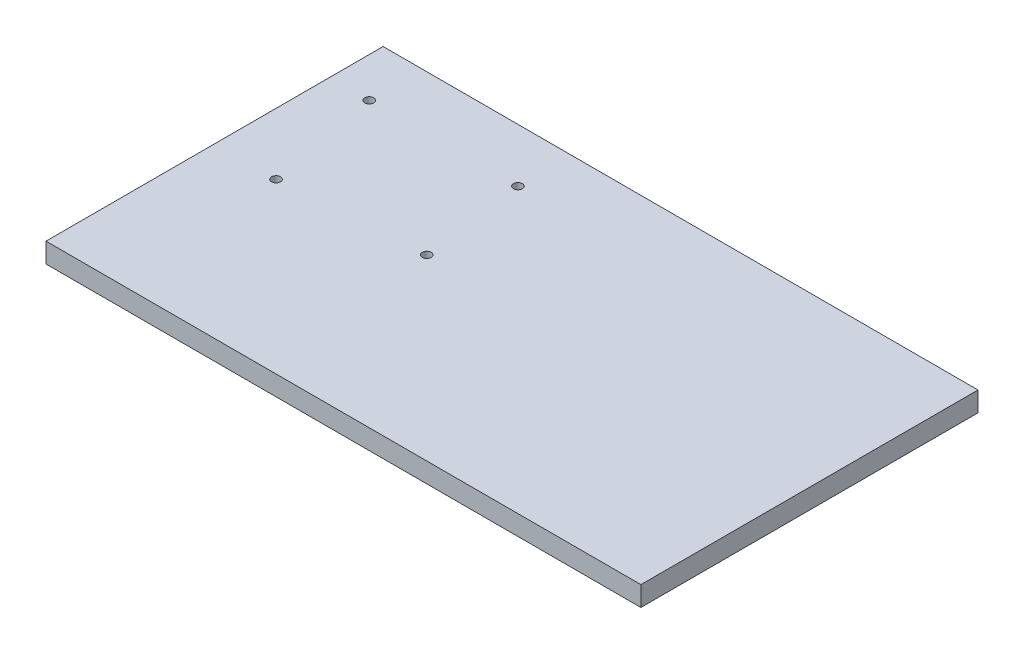
ISO-10303-21;
HEADER;
FILE_DESCRIPTION(('STEP AP214'),'2;1');
FILE_NAME('part.step','',(''),(''),'','','');
FILE_SCHEMA(('AUTOMOTIVE_DESIGN { 1 0 10303 214 1 1 1 1 }'));
ENDSEC;
DATA;
#1=APPLICATION_CONTEXT('core data for automotive mechanical design processes');
#2=APPLICATION_PROTOCOL_DEFINITION('international standard','automotive_design',2000,#1);
#3=PRODUCT_CONTEXT('',#1,'mechanical');
#4=PRODUCT('Part','Part','',(#3));
#5=PRODUCT_RELATED_PRODUCT_CATEGORY('part','',(#4));
#6=PRODUCT_DEFINITION_FORMATION('','',#4);
#7=PRODUCT_DEFINITION_CONTEXT('part definition',#1,'design');
#8=PRODUCT_DEFINITION('design','',#6,#7);
#9=PRODUCT_DEFINITION_SHAPE('','',#8);
#10=(LENGTH_UNIT() NAMED_UNIT(*) SI_UNIT(.MILLI.,.METRE.));
#11=(NAMED_UNIT(*) PLANE_ANGLE_UNIT() SI_UNIT($,.RADIAN.));
#12=(NAMED_UNIT(*) SI_UNIT($,.STERADIAN.) SOLID_ANGLE_UNIT());
#13=UNCERTAINTY_MEASURE_WITH_UNIT(LENGTH_MEASURE(1.E-05),#10,'distance_accuracy_value','');
#14=(GEOMETRIC_REPRESENTATION_CONTEXT(3) GLOBAL_UNCERTAINTY_ASSIGNED_CONTEXT((#13)) GLOBAL_UNIT_ASSIGNED_CONTEXT((#10,
#11,#12)) REPRESENTATION_CONTEXT('',''));
#15=CARTESIAN_POINT('',(0.,0.,0.));
#16=DIRECTION('',(0.,0.,1.));
#17=DIRECTION('',(1.,0.,0.));
#18=AXIS2_PLACEMENT_3D('',#15,#16,#17);
#19=CARTESIAN_POINT('',(0.,10.,0.));
#20=DIRECTION('',(0.,1.,0.));
#21=DIRECTION('',(0.,0.,1.));
#22=AXIS2_PLACEMENT_3D('',#19,#20,#21);
#23=PLANE('',#22);
#24=CARTESIAN_POINT('',(102.,10.,-90.));
#25=DIRECTION('',(0.,1.,0.));
#26=DIRECTION('',(0.,0.,1.));
#27=AXIS2_PLACEMENT_3D('',#24,#25,#26);
#28=CIRCLE('',#27,2.25000000000001);
#29=CARTESIAN_POINT('',(102.,10.,-87.75));
#30=VERTEX_POINT('',#29);
#31=EDGE_CURVE('E123',#30,#30,#28,.T.);
#32=ORIENTED_EDGE('',*,*,#31,.F.);
#33=EDGE_LOOP('',(#32));
#34=FACE_BOUND('',#33,.T.);
#35=CARTESIAN_POINT('',(20.,10.,-143.));
#36=DIRECTION('',(0.,1.,0.));
#37=DIRECTION('',(0.,0.,1.));
#38=AXIS2_PLACEMENT_3D('',#35,#36,#37);
#39=CIRCLE('',#38,2.25);
#40=CARTESIAN_POINT('',(20.,10.,-140.75));
#41=VERTEX_POINT('',#40);
#42=EDGE_CURVE('E102',#41,#41,#39,.T.);
#43=ORIENTED_EDGE('',*,*,#42,.F.);
#44=EDGE_LOOP('',(#43));
#45=FACE_BOUND('',#44,.T.);
#46=DIRECTION('',(0.,0.,1.));
#47=VECTOR('',#46,1.);
#48=CARTESIAN_POINT('',(0.,10.,-170.));
#49=LINE('',#48,#47);
#50=CARTESIAN_POINT('',(0.,10.,-170.));
#51=VERTEX_POINT('',#50);
#52=CARTESIAN_POINT('',(0.,10.,0.));
#53=VERTEX_POINT('',#52);
#54=EDGE_CURVE('E87',#51,#53,#49,.T.);
#55=ORIENTED_EDGE('',*,*,#54,.T.);
#56=DIRECTION('',(1.,0.,0.));
#57=VECTOR('',#56,1.);
#58=CARTESIAN_POINT('',(0.,10.,0.));
#59=LINE('',#58,#57);
#60=CARTESIAN_POINT('',(300.,10.,0.));
#61=VERTEX_POINT('',#60);
#62=EDGE_CURVE('E82',#53,#61,#59,.T.);
#63=ORIENTED_EDGE('',*,*,#62,.T.);
#64=DIRECTION('',(0.,0.,-1.));
#65=VECTOR('',#64,1.);
#66=CARTESIAN_POINT('',(300.,10.,-170.));
#67=LINE('',#66,#65);
#68=CARTESIAN_POINT('',(300.,10.,-170.));
#69=VERTEX_POINT('',#68);
#70=EDGE_CURVE('E85',#61,#69,#67,.T.);
#71=ORIENTED_EDGE('',*,*,#70,.T.);
#72=DIRECTION('',(-1.,0.,0.));
#73=VECTOR('',#72,1.);
#74=CARTESIAN_POINT('',(0.,10.,-170.));
#75=LINE('',#74,#73);
#76=EDGE_CURVE('E52',#69,#51,#75,.T.);
#77=ORIENTED_EDGE('',*,*,#76,.T.);
#78=EDGE_LOOP('',(#55,#63,#71,#77));
#79=FACE_BOUND('',#78,.T.);
#80=CARTESIAN_POINT('',(95.,10.,-143.));
#81=DIRECTION('',(0.,1.,0.));
#82=DIRECTION('',(0.,0.,1.));
#83=AXIS2_PLACEMENT_3D('',#80,#81,#82);
#84=CIRCLE('',#83,2.25000000000001);
#85=CARTESIAN_POINT('',(95.,10.,-140.75));
#86=VERTEX_POINT('',#85);
#87=EDGE_CURVE('E117',#86,#86,#84,.T.);
#88=ORIENTED_EDGE('',*,*,#87,.F.);
#89=EDGE_LOOP('',(#88));
#90=FACE_BOUND('',#89,.T.);
#91=CARTESIAN_POINT('',(31.,10.,-84.9977739581658));
#92=DIRECTION('',(0.,1.,0.));
#93=DIRECTION('',(0.,0.,1.));
#94=AXIS2_PLACEMENT_3D('',#91,#92,#93);
#95=CIRCLE('',#94,2.25);
#96=CARTESIAN_POINT('',(31.,10.,-82.7477739581658));
#97=VERTEX_POINT('',#96);
#98=EDGE_CURVE('E129',#97,#97,#95,.T.);
#99=ORIENTED_EDGE('',*,*,#98,.F.);
#100=EDGE_LOOP('',(#99));
#101=FACE_BOUND('',#100,.T.);
#102=ADVANCED_FACE('F35',(#34,#45,#79,#90,#101),#23,.T.);
#103=CARTESIAN_POINT('',(0.,0.,0.));
#104=DIRECTION('',(0.,1.,0.));
#105=DIRECTION('',(0.,0.,1.));
#106=AXIS2_PLACEMENT_3D('',#103,#104,#105);
#107=PLANE('',#106);
#108=DIRECTION('',(0.,0.,1.));
#109=VECTOR('',#108,1.);
#110=CARTESIAN_POINT('',(0.,0.,-170.));
#111=LINE('',#110,#109);
#112=CARTESIAN_POINT('',(0.,0.,-170.));
#113=VERTEX_POINT('',#112);
#114=CARTESIAN_POINT('',(0.,0.,0.));
#115=VERTEX_POINT('',#114);
#116=EDGE_CURVE('E99',#113,#115,#111,.T.);
#117=ORIENTED_EDGE('',*,*,#116,.F.);
#118=DIRECTION('',(-1.,0.,0.));
#119=VECTOR('',#118,1.);
#120=CARTESIAN_POINT('',(0.,0.,-170.));
#121=LINE('',#120,#119);
#122=CARTESIAN_POINT('',(300.,0.,-170.));
#123=VERTEX_POINT('',#122);
#124=EDGE_CURVE('E75',#123,#113,#121,.T.);
#125=ORIENTED_EDGE('',*,*,#124,.F.);
#126=DIRECTION('',(0.,0.,-1.));
#127=VECTOR('',#126,1.);
#128=CARTESIAN_POINT('',(300.,0.,-170.));
#129=LINE('',#128,#127);
#130=CARTESIAN_POINT('',(300.,0.,0.));
#131=VERTEX_POINT('',#130);
#132=EDGE_CURVE('E69',#131,#123,#129,.T.);
#133=ORIENTED_EDGE('',*,*,#132,.F.);
#134=DIRECTION('',(1.,0.,0.));
#135=VECTOR('',#134,1.);
#136=CARTESIAN_POINT('',(0.,0.,0.));
#137=LINE('',#136,#135);
#138=EDGE_CURVE('E91',#115,#131,#137,.T.);
#139=ORIENTED_EDGE('',*,*,#138,.F.);
#140=EDGE_LOOP('',(#117,#125,#133,#139));
#141=FACE_BOUND('',#140,.T.);
#142=CARTESIAN_POINT('',(20.,0.,-143.));
#143=DIRECTION('',(0.,1.,0.));
#144=DIRECTION('',(0.,0.,1.));
#145=AXIS2_PLACEMENT_3D('',#142,#143,#144);
#146=CIRCLE('',#145,2.25);
#147=CARTESIAN_POINT('',(20.,0.,-140.75));
#148=VERTEX_POINT('',#147);
#149=EDGE_CURVE('E114',#148,#148,#146,.T.);
#150=ORIENTED_EDGE('',*,*,#149,.T.);
#151=EDGE_LOOP('',(#150));
#152=FACE_BOUND('',#151,.T.);
#153=CARTESIAN_POINT('',(95.,0.,-143.));
#154=DIRECTION('',(0.,1.,0.));
#155=DIRECTION('',(0.,0.,1.));
#156=AXIS2_PLACEMENT_3D('',#153,#154,#155);
#157=CIRCLE('',#156,2.25000000000001);
#158=CARTESIAN_POINT('',(95.,0.,-140.75));
#159=VERTEX_POINT('',#158);
#160=EDGE_CURVE('E120',#159,#159,#157,.T.);
#161=ORIENTED_EDGE('',*,*,#160,.T.);
#162=EDGE_LOOP('',(#161));
#163=FACE_BOUND('',#162,.T.);
#164=CARTESIAN_POINT('',(102.,0.,-90.));
#165=DIRECTION('',(0.,1.,0.));
#166=DIRECTION('',(0.,0.,1.));
#167=AXIS2_PLACEMENT_3D('',#164,#165,#166);
#168=CIRCLE('',#167,2.25000000000001);
#169=CARTESIAN_POINT('',(102.,0.,-87.75));
#170=VERTEX_POINT('',#169);
#171=EDGE_CURVE('E126',#170,#170,#168,.T.);
#172=ORIENTED_EDGE('',*,*,#171,.T.);
#173=EDGE_LOOP('',(#172));
#174=FACE_BOUND('',#173,.T.);
#175=CARTESIAN_POINT('',(31.,0.,-84.9977739581658));
#176=DIRECTION('',(0.,1.,0.));
#177=DIRECTION('',(0.,0.,1.));
#178=AXIS2_PLACEMENT_3D('',#175,#176,#177);
#179=CIRCLE('',#178,2.25);
#180=CARTESIAN_POINT('',(31.,0.,-82.7477739581658));
#181=VERTEX_POINT('',#180);
#182=EDGE_CURVE('E132',#181,#181,#179,.T.);
#183=ORIENTED_EDGE('',*,*,#182,.T.);
#184=EDGE_LOOP('',(#183));
#185=FACE_BOUND('',#184,.T.);
#186=ADVANCED_FACE('F110',(#141,#152,#163,#174,#185),#107,.F.);
#187=CARTESIAN_POINT('',(0.,10.,-170.));
#188=DIRECTION('',(1.,0.,0.));
#189=DIRECTION('',(0.,0.,-1.));
#190=AXIS2_PLACEMENT_3D('',#187,#188,#189);
#191=PLANE('',#190);
#192=ORIENTED_EDGE('',*,*,#116,.T.);
#193=DIRECTION('',(0.,-1.,0.));
#194=VECTOR('',#193,1.);
#195=CARTESIAN_POINT('',(0.,10.,0.));
#196=LINE('',#195,#194);
#197=EDGE_CURVE('E11',#53,#115,#196,.T.);
#198=ORIENTED_EDGE('',*,*,#197,.F.);
#199=ORIENTED_EDGE('',*,*,#54,.F.);
#200=DIRECTION('',(0.,-1.,0.));
#201=VECTOR('',#200,1.);
#202=CARTESIAN_POINT('',(0.,10.,-170.));
#203=LINE('',#202,#201);
#204=EDGE_CURVE('E95',#51,#113,#203,.T.);
#205=ORIENTED_EDGE('',*,*,#204,.T.);
#206=EDGE_LOOP('',(#192,#198,#199,#205));
#207=FACE_BOUND('',#206,.T.);
#208=ADVANCED_FACE('F37',(#207),#191,.F.);
#209=CARTESIAN_POINT('',(0.,10.,0.));
#210=DIRECTION('',(0.,0.,-1.));
#211=DIRECTION('',(-1.,0.,0.));
#212=AXIS2_PLACEMENT_3D('',#209,#210,#211);
#213=PLANE('',#212);
#214=ORIENTED_EDGE('',*,*,#138,.T.);
#215=DIRECTION('',(0.,-1.,0.));
#216=VECTOR('',#215,1.);
#217=CARTESIAN_POINT('',(300.,10.,0.));
#218=LINE('',#217,#216);
#219=EDGE_CURVE('E44',#61,#131,#218,.T.);
#220=ORIENTED_EDGE('',*,*,#219,.F.);
#221=ORIENTED_EDGE('',*,*,#62,.F.);
#222=ORIENTED_EDGE('',*,*,#197,.T.);
#223=EDGE_LOOP('',(#214,#220,#221,#222));
#224=FACE_BOUND('',#223,.T.);
#225=ADVANCED_FACE('F90',(#224),#213,.F.);
#226=CARTESIAN_POINT('',(300.,10.,-170.));
#227=DIRECTION('',(-1.,0.,0.));
#228=DIRECTION('',(0.,0.,1.));
#229=AXIS2_PLACEMENT_3D('',#226,#227,#228);
#230=PLANE('',#229);
#231=ORIENTED_EDGE('',*,*,#132,.T.);
#232=DIRECTION('',(0.,-1.,0.));
#233=VECTOR('',#232,1.);
#234=CARTESIAN_POINT('',(300.,10.,-170.));
#235=LINE('',#234,#233);
#236=EDGE_CURVE('E92',#69,#123,#235,.T.);
#237=ORIENTED_EDGE('',*,*,#236,.F.);
#238=ORIENTED_EDGE('',*,*,#70,.F.);
#239=ORIENTED_EDGE('',*,*,#219,.T.);
#240=EDGE_LOOP('',(#231,#237,#238,#239));
#241=FACE_BOUND('',#240,.T.);
#242=ADVANCED_FACE('F93',(#241),#230,.F.);
#243=CARTESIAN_POINT('',(0.,10.,-170.));
#244=DIRECTION('',(0.,0.,1.));
#245=DIRECTION('',(1.,0.,0.));
#246=AXIS2_PLACEMENT_3D('',#243,#244,#245);
#247=PLANE('',#246);
#248=ORIENTED_EDGE('',*,*,#124,.T.);
#249=ORIENTED_EDGE('',*,*,#204,.F.);
#250=ORIENTED_EDGE('',*,*,#76,.F.);
#251=ORIENTED_EDGE('',*,*,#236,.T.);
#252=EDGE_LOOP('',(#248,#249,#250,#251));
#253=FACE_BOUND('',#252,.T.);
#254=ADVANCED_FACE('F107',(#253),#247,.F.);
#255=CARTESIAN_POINT('',(20.,10.,-143.));
#256=DIRECTION('',(0.,-1.,0.));
#257=DIRECTION('',(0.,0.,-1.));
#258=AXIS2_PLACEMENT_3D('',#255,#256,#257);
#259=CYLINDRICAL_SURFACE('',#258,2.25);
#260=ORIENTED_EDGE('',*,*,#42,.T.);
#261=EDGE_LOOP('',(#260));
#262=FACE_BOUND('',#261,.T.);
#263=ORIENTED_EDGE('',*,*,#149,.F.);
#264=EDGE_LOOP('',(#263));
#265=FACE_BOUND('',#264,.T.);
#266=ADVANCED_FACE('F151',(#262,#265),#259,.F.);
#267=CARTESIAN_POINT('',(95.,10.,-143.));
#268=DIRECTION('',(0.,-1.,0.));
#269=DIRECTION('',(0.,0.,-1.));
#270=AXIS2_PLACEMENT_3D('',#267,#268,#269);
#271=CYLINDRICAL_SURFACE('',#270,2.25000000000001);
#272=ORIENTED_EDGE('',*,*,#87,.T.);
#273=EDGE_LOOP('',(#272));
#274=FACE_BOUND('',#273,.T.);
#275=ORIENTED_EDGE('',*,*,#160,.F.);
#276=EDGE_LOOP('',(#275));
#277=FACE_BOUND('',#276,.T.);
#278=ADVANCED_FACE('F197',(#274,#277),#271,.F.);
#279=CARTESIAN_POINT('',(102.,10.,-90.));
#280=DIRECTION('',(0.,-1.,0.));
#281=DIRECTION('',(0.,0.,-1.));
#282=AXIS2_PLACEMENT_3D('',#279,#280,#281);
#283=CYLINDRICAL_SURFACE('',#282,2.25000000000001);
#284=ORIENTED_EDGE('',*,*,#31,.T.);
#285=EDGE_LOOP('',(#284));
#286=FACE_BOUND('',#285,.T.);
#287=ORIENTED_EDGE('',*,*,#171,.F.);
#288=EDGE_LOOP('',(#287));
#289=FACE_BOUND('',#288,.T.);
#290=ADVANCED_FACE('F205',(#286,#289),#283,.F.);
#291=CARTESIAN_POINT('',(31.,10.,-84.9977739581658));
#292=DIRECTION('',(0.,-1.,0.));
#293=DIRECTION('',(0.,0.,-1.));
#294=AXIS2_PLACEMENT_3D('',#291,#292,#293);
#295=CYLINDRICAL_SURFACE('',#294,2.25);
#296=ORIENTED_EDGE('',*,*,#98,.T.);
#297=EDGE_LOOP('',(#296));
#298=FACE_BOUND('',#297,.T.);
#299=ORIENTED_EDGE('',*,*,#182,.F.);
#300=EDGE_LOOP('',(#299));
#301=FACE_BOUND('',#300,.T.);
#302=ADVANCED_FACE('F138',(#298,#301),#295,.F.);
#303=CLOSED_SHELL('',(#102,#186,#208,#225,#242,#254,#266,#278,#290,#302));
#304=MANIFOLD_SOLID_BREP('B2',#303);
#305=ADVANCED_BREP_SHAPE_REPRESENTATION('',(#18,#304),#14);
#306=SHAPE_DEFINITION_REPRESENTATION(#9,#305);
ENDSEC;
END-ISO-10303-21;
